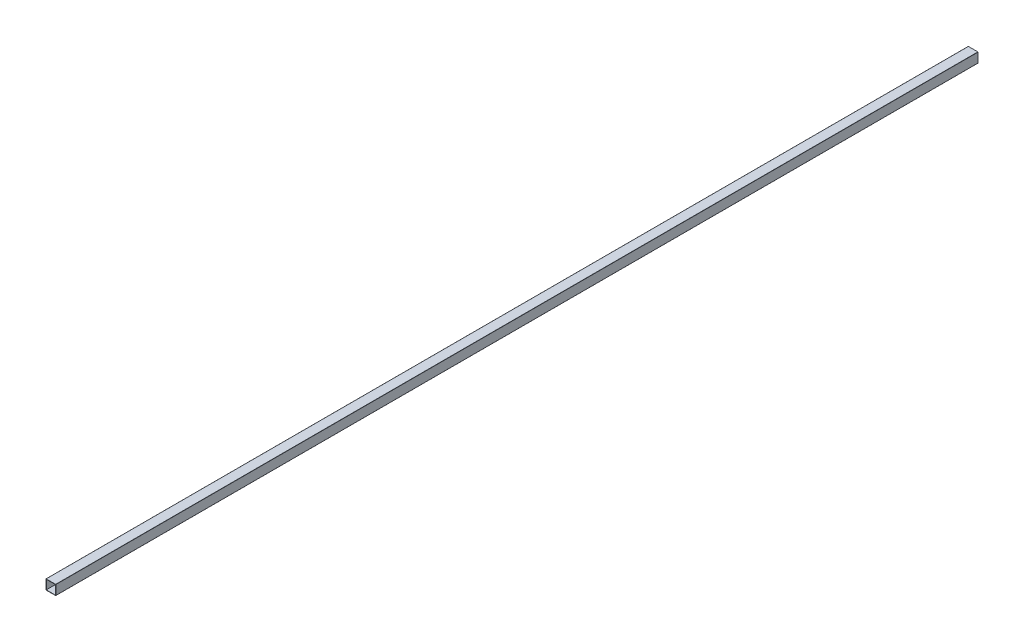
ISO-10303-21;
HEADER;
FILE_DESCRIPTION(('STEP AP214'),'2;1');
FILE_NAME('part.step','',(''),(''),'','','');
FILE_SCHEMA(('AUTOMOTIVE_DESIGN { 1 0 10303 214 1 1 1 1 }'));
ENDSEC;
DATA;
#1=APPLICATION_CONTEXT('core data for automotive mechanical design processes');
#2=APPLICATION_PROTOCOL_DEFINITION('international standard','automotive_design',2000,#1);
#3=PRODUCT_CONTEXT('',#1,'mechanical');
#4=PRODUCT('Part','Part','',(#3));
#5=PRODUCT_RELATED_PRODUCT_CATEGORY('part','',(#4));
#6=PRODUCT_DEFINITION_FORMATION('','',#4);
#7=PRODUCT_DEFINITION_CONTEXT('part definition',#1,'design');
#8=PRODUCT_DEFINITION('design','',#6,#7);
#9=PRODUCT_DEFINITION_SHAPE('','',#8);
#10=(LENGTH_UNIT() NAMED_UNIT(*) SI_UNIT(.MILLI.,.METRE.));
#11=(NAMED_UNIT(*) PLANE_ANGLE_UNIT() SI_UNIT($,.RADIAN.));
#12=(NAMED_UNIT(*) SI_UNIT($,.STERADIAN.) SOLID_ANGLE_UNIT());
#13=UNCERTAINTY_MEASURE_WITH_UNIT(LENGTH_MEASURE(1.E-05),#10,'distance_accuracy_value','');
#14=(GEOMETRIC_REPRESENTATION_CONTEXT(3) GLOBAL_UNCERTAINTY_ASSIGNED_CONTEXT((#13)) GLOBAL_UNIT_ASSIGNED_CONTEXT((#10,
#11,#12)) REPRESENTATION_CONTEXT('',''));
#15=CARTESIAN_POINT('',(0.,0.,0.));
#16=DIRECTION('',(0.,0.,1.));
#17=DIRECTION('',(1.,0.,0.));
#18=AXIS2_PLACEMENT_3D('',#15,#16,#17);
#19=CARTESIAN_POINT('',(-30.75,-30.75,6000.));
#20=DIRECTION('',(0.,0.,-1.));
#21=DIRECTION('',(-1.,0.,0.));
#22=AXIS2_PLACEMENT_3D('',#19,#20,#21);
#23=PLANE('',#22);
#24=CARTESIAN_POINT('',(-30.75,-30.75,6000.));
#25=DIRECTION('',(0.,0.,1.));
#26=DIRECTION('',(-1.,0.,0.));
#27=AXIS2_PLACEMENT_3D('',#24,#25,#26);
#28=CIRCLE('',#27,1.);
#29=CARTESIAN_POINT('',(-31.75,-30.75,6000.));
#30=VERTEX_POINT('',#29);
#31=CARTESIAN_POINT('',(-30.75,-31.75,6000.));
#32=VERTEX_POINT('',#31);
#33=EDGE_CURVE('E158',#30,#32,#28,.T.);
#34=ORIENTED_EDGE('',*,*,#33,.T.);
#35=DIRECTION('',(1.,0.,0.));
#36=VECTOR('',#35,1.);
#37=CARTESIAN_POINT('',(-30.75,-31.75,6000.));
#38=LINE('',#37,#36);
#39=CARTESIAN_POINT('',(30.75,-31.75,6000.));
#40=VERTEX_POINT('',#39);
#41=EDGE_CURVE('E161',#32,#40,#38,.T.);
#42=ORIENTED_EDGE('',*,*,#41,.T.);
#43=CARTESIAN_POINT('',(30.75,-30.75,6000.));
#44=DIRECTION('',(0.,0.,1.));
#45=DIRECTION('',(1.,0.,0.));
#46=AXIS2_PLACEMENT_3D('',#43,#44,#45);
#47=CIRCLE('',#46,1.);
#48=CARTESIAN_POINT('',(31.75,-30.75,6000.));
#49=VERTEX_POINT('',#48);
#50=EDGE_CURVE('E164',#40,#49,#47,.T.);
#51=ORIENTED_EDGE('',*,*,#50,.T.);
#52=DIRECTION('',(0.,1.,0.));
#53=VECTOR('',#52,1.);
#54=CARTESIAN_POINT('',(31.75,-30.75,6000.));
#55=LINE('',#54,#53);
#56=CARTESIAN_POINT('',(31.75,30.75,6000.));
#57=VERTEX_POINT('',#56);
#58=EDGE_CURVE('E166',#49,#57,#55,.T.);
#59=ORIENTED_EDGE('',*,*,#58,.T.);
#60=CARTESIAN_POINT('',(30.75,30.75,6000.));
#61=DIRECTION('',(0.,0.,1.));
#62=DIRECTION('',(-1.,0.,0.));
#63=AXIS2_PLACEMENT_3D('',#60,#61,#62);
#64=CIRCLE('',#63,1.);
#65=CARTESIAN_POINT('',(30.75,31.75,6000.));
#66=VERTEX_POINT('',#65);
#67=EDGE_CURVE('E168',#57,#66,#64,.T.);
#68=ORIENTED_EDGE('',*,*,#67,.T.);
#69=DIRECTION('',(-1.,0.,0.));
#70=VECTOR('',#69,1.);
#71=CARTESIAN_POINT('',(-30.75,31.75,6000.));
#72=LINE('',#71,#70);
#73=CARTESIAN_POINT('',(-30.75,31.75,6000.));
#74=VERTEX_POINT('',#73);
#75=EDGE_CURVE('E170',#66,#74,#72,.T.);
#76=ORIENTED_EDGE('',*,*,#75,.T.);
#77=CARTESIAN_POINT('',(-30.75,30.75,6000.));
#78=DIRECTION('',(0.,0.,1.));
#79=DIRECTION('',(-1.,0.,0.));
#80=AXIS2_PLACEMENT_3D('',#77,#78,#79);
#81=CIRCLE('',#80,1.);
#82=CARTESIAN_POINT('',(-31.75,30.75,6000.));
#83=VERTEX_POINT('',#82);
#84=EDGE_CURVE('E172',#74,#83,#81,.T.);
#85=ORIENTED_EDGE('',*,*,#84,.T.);
#86=DIRECTION('',(0.,-1.,0.));
#87=VECTOR('',#86,1.);
#88=CARTESIAN_POINT('',(-31.75,-30.75,6000.));
#89=LINE('',#88,#87);
#90=EDGE_CURVE('E174',#83,#30,#89,.T.);
#91=ORIENTED_EDGE('',*,*,#90,.T.);
#92=EDGE_LOOP('',(#34,#42,#51,#59,#68,#76,#85,#91));
#93=FACE_BOUND('',#92,.T.);
#94=DIRECTION('',(1.,0.,0.));
#95=VECTOR('',#94,1.);
#96=CARTESIAN_POINT('',(-29.86,-29.86,6000.));
#97=LINE('',#96,#95);
#98=CARTESIAN_POINT('',(-29.86,-29.86,6000.));
#99=VERTEX_POINT('',#98);
#100=CARTESIAN_POINT('',(29.86,-29.86,6000.));
#101=VERTEX_POINT('',#100);
#102=EDGE_CURVE('E122',#99,#101,#97,.T.);
#103=ORIENTED_EDGE('',*,*,#102,.F.);
#104=DIRECTION('',(0.,-1.,0.));
#105=VECTOR('',#104,1.);
#106=CARTESIAN_POINT('',(-29.86,-29.86,6000.));
#107=LINE('',#106,#105);
#108=CARTESIAN_POINT('',(-29.86,29.86,6000.));
#109=VERTEX_POINT('',#108);
#110=EDGE_CURVE('E144',#109,#99,#107,.T.);
#111=ORIENTED_EDGE('',*,*,#110,.F.);
#112=DIRECTION('',(-1.,0.,0.));
#113=VECTOR('',#112,1.);
#114=CARTESIAN_POINT('',(-29.86,29.86,6000.));
#115=LINE('',#114,#113);
#116=CARTESIAN_POINT('',(29.86,29.86,6000.));
#117=VERTEX_POINT('',#116);
#118=EDGE_CURVE('E142',#117,#109,#115,.T.);
#119=ORIENTED_EDGE('',*,*,#118,.F.);
#120=DIRECTION('',(0.,1.,0.));
#121=VECTOR('',#120,1.);
#122=CARTESIAN_POINT('',(29.86,-29.86,6000.));
#123=LINE('',#122,#121);
#124=EDGE_CURVE('E130',#101,#117,#123,.T.);
#125=ORIENTED_EDGE('',*,*,#124,.F.);
#126=EDGE_LOOP('',(#103,#111,#119,#125));
#127=FACE_BOUND('',#126,.T.);
#128=ADVANCED_FACE('F33',(#93,#127),#23,.F.);
#129=CARTESIAN_POINT('',(-30.75,-30.75,0.));
#130=DIRECTION('',(0.,0.,-1.));
#131=DIRECTION('',(-1.,0.,0.));
#132=AXIS2_PLACEMENT_3D('',#129,#130,#131);
#133=PLANE('',#132);
#134=CARTESIAN_POINT('',(-30.75,-30.75,0.));
#135=DIRECTION('',(0.,0.,1.));
#136=DIRECTION('',(-1.,0.,0.));
#137=AXIS2_PLACEMENT_3D('',#134,#135,#136);
#138=CIRCLE('',#137,1.);
#139=CARTESIAN_POINT('',(-31.75,-30.75,0.));
#140=VERTEX_POINT('',#139);
#141=CARTESIAN_POINT('',(-30.75,-31.75,0.));
#142=VERTEX_POINT('',#141);
#143=EDGE_CURVE('E138',#140,#142,#138,.T.);
#144=ORIENTED_EDGE('',*,*,#143,.F.);
#145=DIRECTION('',(0.,-1.,0.));
#146=VECTOR('',#145,1.);
#147=CARTESIAN_POINT('',(-31.75,-30.75,0.));
#148=LINE('',#147,#146);
#149=CARTESIAN_POINT('',(-31.75,30.75,0.));
#150=VERTEX_POINT('',#149);
#151=EDGE_CURVE('E162',#150,#140,#148,.T.);
#152=ORIENTED_EDGE('',*,*,#151,.F.);
#153=CARTESIAN_POINT('',(-30.75,30.75,0.));
#154=DIRECTION('',(0.,0.,1.));
#155=DIRECTION('',(-1.,0.,0.));
#156=AXIS2_PLACEMENT_3D('',#153,#154,#155);
#157=CIRCLE('',#156,1.);
#158=CARTESIAN_POINT('',(-30.75,31.75,0.));
#159=VERTEX_POINT('',#158);
#160=EDGE_CURVE('E189',#159,#150,#157,.T.);
#161=ORIENTED_EDGE('',*,*,#160,.F.);
#162=DIRECTION('',(-1.,0.,0.));
#163=VECTOR('',#162,1.);
#164=CARTESIAN_POINT('',(-30.75,31.75,0.));
#165=LINE('',#164,#163);
#166=CARTESIAN_POINT('',(30.75,31.75,0.));
#167=VERTEX_POINT('',#166);
#168=EDGE_CURVE('E187',#167,#159,#165,.T.);
#169=ORIENTED_EDGE('',*,*,#168,.F.);
#170=CARTESIAN_POINT('',(30.75,30.75,0.));
#171=DIRECTION('',(0.,0.,1.));
#172=DIRECTION('',(-1.,0.,0.));
#173=AXIS2_PLACEMENT_3D('',#170,#171,#172);
#174=CIRCLE('',#173,1.);
#175=CARTESIAN_POINT('',(31.75,30.75,0.));
#176=VERTEX_POINT('',#175);
#177=EDGE_CURVE('E185',#176,#167,#174,.T.);
#178=ORIENTED_EDGE('',*,*,#177,.F.);
#179=DIRECTION('',(0.,1.,0.));
#180=VECTOR('',#179,1.);
#181=CARTESIAN_POINT('',(31.75,-30.75,0.));
#182=LINE('',#181,#180);
#183=CARTESIAN_POINT('',(31.75,-30.75,0.));
#184=VERTEX_POINT('',#183);
#185=EDGE_CURVE('E183',#184,#176,#182,.T.);
#186=ORIENTED_EDGE('',*,*,#185,.F.);
#187=CARTESIAN_POINT('',(30.75,-30.75,0.));
#188=DIRECTION('',(0.,0.,1.));
#189=DIRECTION('',(1.,0.,0.));
#190=AXIS2_PLACEMENT_3D('',#187,#188,#189);
#191=CIRCLE('',#190,1.);
#192=CARTESIAN_POINT('',(30.75,-31.75,0.));
#193=VERTEX_POINT('',#192);
#194=EDGE_CURVE('E181',#193,#184,#191,.T.);
#195=ORIENTED_EDGE('',*,*,#194,.F.);
#196=DIRECTION('',(1.,0.,0.));
#197=VECTOR('',#196,1.);
#198=CARTESIAN_POINT('',(-30.75,-31.75,0.));
#199=LINE('',#198,#197);
#200=EDGE_CURVE('E179',#142,#193,#199,.T.);
#201=ORIENTED_EDGE('',*,*,#200,.F.);
#202=EDGE_LOOP('',(#144,#152,#161,#169,#178,#186,#195,#201));
#203=FACE_BOUND('',#202,.T.);
#204=DIRECTION('',(0.,-1.,0.));
#205=VECTOR('',#204,1.);
#206=CARTESIAN_POINT('',(-29.86,-29.86,0.));
#207=LINE('',#206,#205);
#208=CARTESIAN_POINT('',(-29.86,29.86,0.));
#209=VERTEX_POINT('',#208);
#210=CARTESIAN_POINT('',(-29.86,-29.86,0.));
#211=VERTEX_POINT('',#210);
#212=EDGE_CURVE('E131',#209,#211,#207,.T.);
#213=ORIENTED_EDGE('',*,*,#212,.T.);
#214=DIRECTION('',(1.,0.,0.));
#215=VECTOR('',#214,1.);
#216=CARTESIAN_POINT('',(-29.86,-29.86,0.));
#217=LINE('',#216,#215);
#218=CARTESIAN_POINT('',(29.86,-29.86,0.));
#219=VERTEX_POINT('',#218);
#220=EDGE_CURVE('E56',#211,#219,#217,.T.);
#221=ORIENTED_EDGE('',*,*,#220,.T.);
#222=DIRECTION('',(0.,1.,0.));
#223=VECTOR('',#222,1.);
#224=CARTESIAN_POINT('',(29.86,-29.86,0.));
#225=LINE('',#224,#223);
#226=CARTESIAN_POINT('',(29.86,29.86,0.));
#227=VERTEX_POINT('',#226);
#228=EDGE_CURVE('E137',#219,#227,#225,.T.);
#229=ORIENTED_EDGE('',*,*,#228,.T.);
#230=DIRECTION('',(-1.,0.,0.));
#231=VECTOR('',#230,1.);
#232=CARTESIAN_POINT('',(-29.86,29.86,0.));
#233=LINE('',#232,#231);
#234=EDGE_CURVE('E150',#227,#209,#233,.T.);
#235=ORIENTED_EDGE('',*,*,#234,.T.);
#236=EDGE_LOOP('',(#213,#221,#229,#235));
#237=FACE_BOUND('',#236,.T.);
#238=ADVANCED_FACE('F219',(#203,#237),#133,.T.);
#239=CARTESIAN_POINT('',(-30.75,-30.75,6000.));
#240=DIRECTION('',(0.,0.,-1.));
#241=DIRECTION('',(-1.,0.,0.));
#242=AXIS2_PLACEMENT_3D('',#239,#240,#241);
#243=CYLINDRICAL_SURFACE('',#242,1.);
#244=ORIENTED_EDGE('',*,*,#143,.T.);
#245=DIRECTION('',(0.,0.,-1.));
#246=VECTOR('',#245,1.);
#247=CARTESIAN_POINT('',(-30.75,-31.75,6000.));
#248=LINE('',#247,#246);
#249=EDGE_CURVE('E11',#32,#142,#248,.T.);
#250=ORIENTED_EDGE('',*,*,#249,.F.);
#251=ORIENTED_EDGE('',*,*,#33,.F.);
#252=DIRECTION('',(0.,0.,-1.));
#253=VECTOR('',#252,1.);
#254=CARTESIAN_POINT('',(-31.75,-30.75,6000.));
#255=LINE('',#254,#253);
#256=EDGE_CURVE('E176',#30,#140,#255,.T.);
#257=ORIENTED_EDGE('',*,*,#256,.T.);
#258=EDGE_LOOP('',(#244,#250,#251,#257));
#259=FACE_BOUND('',#258,.T.);
#260=ADVANCED_FACE('F35',(#259),#243,.T.);
#261=CARTESIAN_POINT('',(-30.75,-31.75,6000.));
#262=DIRECTION('',(0.,1.,0.));
#263=DIRECTION('',(0.,0.,1.));
#264=AXIS2_PLACEMENT_3D('',#261,#262,#263);
#265=PLANE('',#264);
#266=ORIENTED_EDGE('',*,*,#200,.T.);
#267=DIRECTION('',(0.,0.,-1.));
#268=VECTOR('',#267,1.);
#269=CARTESIAN_POINT('',(30.75,-31.75,6000.));
#270=LINE('',#269,#268);
#271=EDGE_CURVE('E41',#40,#193,#270,.T.);
#272=ORIENTED_EDGE('',*,*,#271,.F.);
#273=ORIENTED_EDGE('',*,*,#41,.F.);
#274=ORIENTED_EDGE('',*,*,#249,.T.);
#275=EDGE_LOOP('',(#266,#272,#273,#274));
#276=FACE_BOUND('',#275,.T.);
#277=ADVANCED_FACE('F236',(#276),#265,.F.);
#278=CARTESIAN_POINT('',(30.75,-30.75,6000.));
#279=DIRECTION('',(0.,0.,-1.));
#280=DIRECTION('',(-1.,0.,0.));
#281=AXIS2_PLACEMENT_3D('',#278,#279,#280);
#282=CYLINDRICAL_SURFACE('',#281,1.);
#283=ORIENTED_EDGE('',*,*,#194,.T.);
#284=DIRECTION('',(0.,0.,-1.));
#285=VECTOR('',#284,1.);
#286=CARTESIAN_POINT('',(31.75,-30.75,6000.));
#287=LINE('',#286,#285);
#288=EDGE_CURVE('E206',#49,#184,#287,.T.);
#289=ORIENTED_EDGE('',*,*,#288,.F.);
#290=ORIENTED_EDGE('',*,*,#50,.F.);
#291=ORIENTED_EDGE('',*,*,#271,.T.);
#292=EDGE_LOOP('',(#283,#289,#290,#291));
#293=FACE_BOUND('',#292,.T.);
#294=ADVANCED_FACE('F213',(#293),#282,.T.);
#295=CARTESIAN_POINT('',(31.75,-30.75,6000.));
#296=DIRECTION('',(-1.,0.,0.));
#297=DIRECTION('',(0.,0.,1.));
#298=AXIS2_PLACEMENT_3D('',#295,#296,#297);
#299=PLANE('',#298);
#300=ORIENTED_EDGE('',*,*,#185,.T.);
#301=DIRECTION('',(0.,0.,-1.));
#302=VECTOR('',#301,1.);
#303=CARTESIAN_POINT('',(31.75,30.75,6000.));
#304=LINE('',#303,#302);
#305=EDGE_CURVE('E203',#57,#176,#304,.T.);
#306=ORIENTED_EDGE('',*,*,#305,.F.);
#307=ORIENTED_EDGE('',*,*,#58,.F.);
#308=ORIENTED_EDGE('',*,*,#288,.T.);
#309=EDGE_LOOP('',(#300,#306,#307,#308));
#310=FACE_BOUND('',#309,.T.);
#311=ADVANCED_FACE('F225',(#310),#299,.F.);
#312=CARTESIAN_POINT('',(30.75,30.75,6000.));
#313=DIRECTION('',(0.,0.,-1.));
#314=DIRECTION('',(-1.,0.,0.));
#315=AXIS2_PLACEMENT_3D('',#312,#313,#314);
#316=CYLINDRICAL_SURFACE('',#315,1.);
#317=ORIENTED_EDGE('',*,*,#177,.T.);
#318=DIRECTION('',(0.,0.,-1.));
#319=VECTOR('',#318,1.);
#320=CARTESIAN_POINT('',(30.75,31.75,6000.));
#321=LINE('',#320,#319);
#322=EDGE_CURVE('E200',#66,#167,#321,.T.);
#323=ORIENTED_EDGE('',*,*,#322,.F.);
#324=ORIENTED_EDGE('',*,*,#67,.F.);
#325=ORIENTED_EDGE('',*,*,#305,.T.);
#326=EDGE_LOOP('',(#317,#323,#324,#325));
#327=FACE_BOUND('',#326,.T.);
#328=ADVANCED_FACE('F229',(#327),#316,.T.);
#329=CARTESIAN_POINT('',(-30.75,31.75,6000.));
#330=DIRECTION('',(0.,-1.,0.));
#331=DIRECTION('',(0.,0.,-1.));
#332=AXIS2_PLACEMENT_3D('',#329,#330,#331);
#333=PLANE('',#332);
#334=ORIENTED_EDGE('',*,*,#168,.T.);
#335=DIRECTION('',(0.,0.,-1.));
#336=VECTOR('',#335,1.);
#337=CARTESIAN_POINT('',(-30.75,31.75,6000.));
#338=LINE('',#337,#336);
#339=EDGE_CURVE('E197',#74,#159,#338,.T.);
#340=ORIENTED_EDGE('',*,*,#339,.F.);
#341=ORIENTED_EDGE('',*,*,#75,.F.);
#342=ORIENTED_EDGE('',*,*,#322,.T.);
#343=EDGE_LOOP('',(#334,#340,#341,#342));
#344=FACE_BOUND('',#343,.T.);
#345=ADVANCED_FACE('F249',(#344),#333,.F.);
#346=CARTESIAN_POINT('',(-30.75,30.75,6000.));
#347=DIRECTION('',(0.,0.,-1.));
#348=DIRECTION('',(-1.,0.,0.));
#349=AXIS2_PLACEMENT_3D('',#346,#347,#348);
#350=CYLINDRICAL_SURFACE('',#349,1.);
#351=ORIENTED_EDGE('',*,*,#160,.T.);
#352=DIRECTION('',(0.,0.,-1.));
#353=VECTOR('',#352,1.);
#354=CARTESIAN_POINT('',(-31.75,30.75,6000.));
#355=LINE('',#354,#353);
#356=EDGE_CURVE('E194',#83,#150,#355,.T.);
#357=ORIENTED_EDGE('',*,*,#356,.F.);
#358=ORIENTED_EDGE('',*,*,#84,.F.);
#359=ORIENTED_EDGE('',*,*,#339,.T.);
#360=EDGE_LOOP('',(#351,#357,#358,#359));
#361=FACE_BOUND('',#360,.T.);
#362=ADVANCED_FACE('F247',(#361),#350,.T.);
#363=CARTESIAN_POINT('',(-31.75,-30.75,6000.));
#364=DIRECTION('',(1.,0.,0.));
#365=DIRECTION('',(0.,0.,-1.));
#366=AXIS2_PLACEMENT_3D('',#363,#364,#365);
#367=PLANE('',#366);
#368=ORIENTED_EDGE('',*,*,#151,.T.);
#369=ORIENTED_EDGE('',*,*,#256,.F.);
#370=ORIENTED_EDGE('',*,*,#90,.F.);
#371=ORIENTED_EDGE('',*,*,#356,.T.);
#372=EDGE_LOOP('',(#368,#369,#370,#371));
#373=FACE_BOUND('',#372,.T.);
#374=ADVANCED_FACE('F242',(#373),#367,.F.);
#375=CARTESIAN_POINT('',(-29.86,-29.86,6000.));
#376=DIRECTION('',(0.,1.,0.));
#377=DIRECTION('',(0.,0.,1.));
#378=AXIS2_PLACEMENT_3D('',#375,#376,#377);
#379=PLANE('',#378);
#380=ORIENTED_EDGE('',*,*,#220,.F.);
#381=DIRECTION('',(0.,0.,-1.));
#382=VECTOR('',#381,1.);
#383=CARTESIAN_POINT('',(-29.86,-29.86,6000.));
#384=LINE('',#383,#382);
#385=EDGE_CURVE('E126',#99,#211,#384,.T.);
#386=ORIENTED_EDGE('',*,*,#385,.F.);
#387=ORIENTED_EDGE('',*,*,#102,.T.);
#388=DIRECTION('',(0.,0.,-1.));
#389=VECTOR('',#388,1.);
#390=CARTESIAN_POINT('',(29.86,-29.86,6000.));
#391=LINE('',#390,#389);
#392=EDGE_CURVE('E125',#101,#219,#391,.T.);
#393=ORIENTED_EDGE('',*,*,#392,.T.);
#394=EDGE_LOOP('',(#380,#386,#387,#393));
#395=FACE_BOUND('',#394,.T.);
#396=ADVANCED_FACE('F124',(#395),#379,.T.);
#397=CARTESIAN_POINT('',(29.86,-29.86,6000.));
#398=DIRECTION('',(-1.,0.,0.));
#399=DIRECTION('',(0.,-1.,0.));
#400=AXIS2_PLACEMENT_3D('',#397,#398,#399);
#401=PLANE('',#400);
#402=ORIENTED_EDGE('',*,*,#228,.F.);
#403=ORIENTED_EDGE('',*,*,#392,.F.);
#404=ORIENTED_EDGE('',*,*,#124,.T.);
#405=DIRECTION('',(0.,0.,-1.));
#406=VECTOR('',#405,1.);
#407=CARTESIAN_POINT('',(29.86,29.86,6000.));
#408=LINE('',#407,#406);
#409=EDGE_CURVE('E139',#117,#227,#408,.T.);
#410=ORIENTED_EDGE('',*,*,#409,.T.);
#411=EDGE_LOOP('',(#402,#403,#404,#410));
#412=FACE_BOUND('',#411,.T.);
#413=ADVANCED_FACE('F134',(#412),#401,.T.);
#414=CARTESIAN_POINT('',(-29.86,29.86,6000.));
#415=DIRECTION('',(0.,-1.,0.));
#416=DIRECTION('',(1.,0.,0.));
#417=AXIS2_PLACEMENT_3D('',#414,#415,#416);
#418=PLANE('',#417);
#419=ORIENTED_EDGE('',*,*,#234,.F.);
#420=ORIENTED_EDGE('',*,*,#409,.F.);
#421=ORIENTED_EDGE('',*,*,#118,.T.);
#422=DIRECTION('',(0.,0.,-1.));
#423=VECTOR('',#422,1.);
#424=CARTESIAN_POINT('',(-29.86,29.86,6000.));
#425=LINE('',#424,#423);
#426=EDGE_CURVE('E48',#109,#209,#425,.T.);
#427=ORIENTED_EDGE('',*,*,#426,.T.);
#428=EDGE_LOOP('',(#419,#420,#421,#427));
#429=FACE_BOUND('',#428,.T.);
#430=ADVANCED_FACE('F274',(#429),#418,.T.);
#431=CARTESIAN_POINT('',(-29.86,-29.86,6000.));
#432=DIRECTION('',(1.,0.,0.));
#433=DIRECTION('',(0.,0.,-1.));
#434=AXIS2_PLACEMENT_3D('',#431,#432,#433);
#435=PLANE('',#434);
#436=ORIENTED_EDGE('',*,*,#212,.F.);
#437=ORIENTED_EDGE('',*,*,#426,.F.);
#438=ORIENTED_EDGE('',*,*,#110,.T.);
#439=ORIENTED_EDGE('',*,*,#385,.T.);
#440=EDGE_LOOP('',(#436,#437,#438,#439));
#441=FACE_BOUND('',#440,.T.);
#442=ADVANCED_FACE('F278',(#441),#435,.T.);
#443=CLOSED_SHELL('',(#128,#238,#260,#277,#294,#311,#328,#345,#362,#374,#396,#413,#430,#442));
#444=MANIFOLD_SOLID_BREP('B2',#443);
#445=ADVANCED_BREP_SHAPE_REPRESENTATION('',(#18,#444),#14);
#446=SHAPE_DEFINITION_REPRESENTATION(#9,#445);
ENDSEC;
END-ISO-10303-21;
